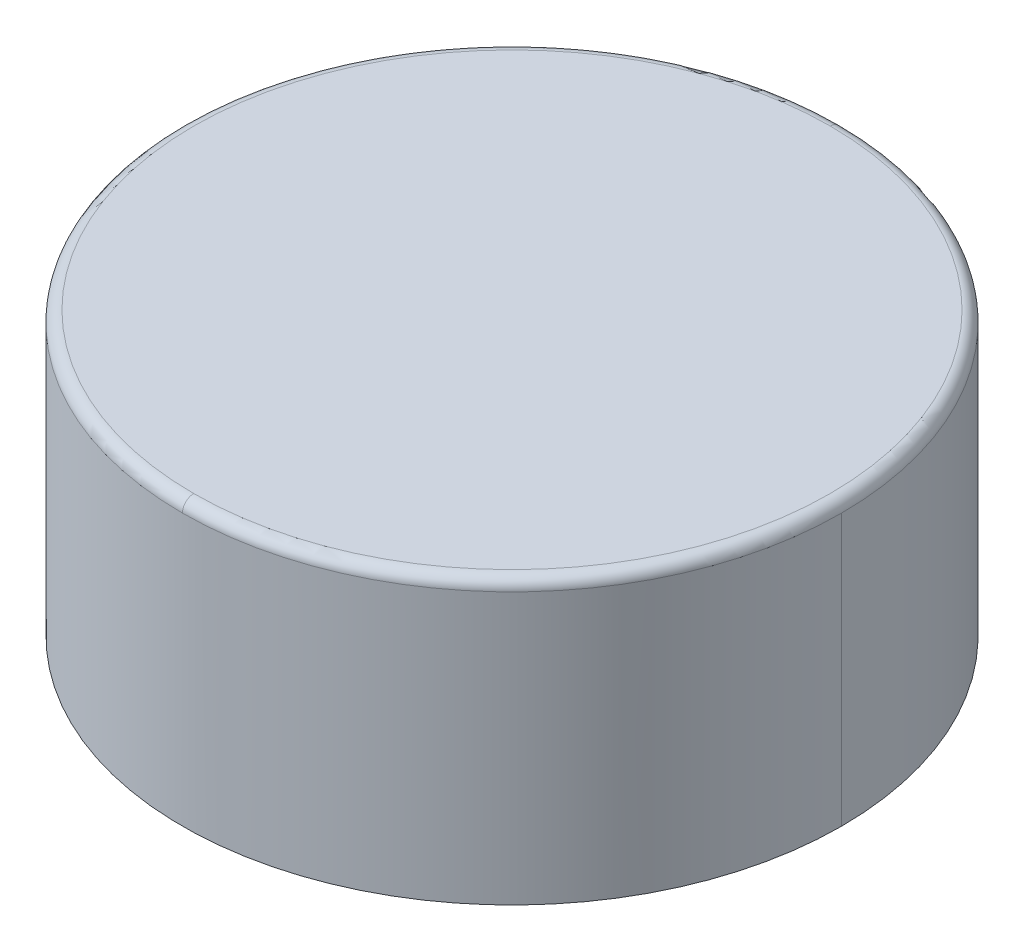
ISO-10303-21;
HEADER;
FILE_DESCRIPTION(('STEP AP214'),'2;1');
FILE_NAME('part.step','',(''),(''),'','','');
FILE_SCHEMA(('AUTOMOTIVE_DESIGN { 1 0 10303 214 1 1 1 1 }'));
ENDSEC;
DATA;
#1=APPLICATION_CONTEXT('core data for automotive mechanical design processes');
#2=APPLICATION_PROTOCOL_DEFINITION('international standard','automotive_design',2000,#1);
#3=PRODUCT_CONTEXT('',#1,'mechanical');
#4=PRODUCT('Part','Part','',(#3));
#5=PRODUCT_RELATED_PRODUCT_CATEGORY('part','',(#4));
#6=PRODUCT_DEFINITION_FORMATION('','',#4);
#7=PRODUCT_DEFINITION_CONTEXT('part definition',#1,'design');
#8=PRODUCT_DEFINITION('design','',#6,#7);
#9=PRODUCT_DEFINITION_SHAPE('','',#8);
#10=(LENGTH_UNIT() NAMED_UNIT(*) SI_UNIT(.MILLI.,.METRE.));
#11=(NAMED_UNIT(*) PLANE_ANGLE_UNIT() SI_UNIT($,.RADIAN.));
#12=(NAMED_UNIT(*) SI_UNIT($,.STERADIAN.) SOLID_ANGLE_UNIT());
#13=UNCERTAINTY_MEASURE_WITH_UNIT(LENGTH_MEASURE(1.E-05),#10,'distance_accuracy_value','');
#14=(GEOMETRIC_REPRESENTATION_CONTEXT(3) GLOBAL_UNCERTAINTY_ASSIGNED_CONTEXT((#13)) GLOBAL_UNIT_ASSIGNED_CONTEXT((#10,
#11,#12)) REPRESENTATION_CONTEXT('',''));
#15=CARTESIAN_POINT('',(0.,0.,0.));
#16=DIRECTION('',(0.,0.,1.));
#17=DIRECTION('',(1.,0.,0.));
#18=AXIS2_PLACEMENT_3D('',#15,#16,#17);
#19=CARTESIAN_POINT('',(6.25,3.625,21.03));
#20=DIRECTION('',(0.,1.,0.));
#21=DIRECTION('',(1.,0.,0.));
#22=AXIS2_PLACEMENT_3D('',#19,#20,#21);
#23=PLANE('',#22);
#24=CARTESIAN_POINT('',(6.25,3.625,21.03));
#25=DIRECTION('',(0.,-1.,0.));
#26=DIRECTION('',(1.,0.,0.));
#27=AXIS2_PLACEMENT_3D('',#24,#25,#26);
#28=CIRCLE('',#27,0.845);
#29=CARTESIAN_POINT('',(7.095,3.625,21.03));
#30=VERTEX_POINT('',#29);
#31=CARTESIAN_POINT('',(6.25,3.625,21.875));
#32=VERTEX_POINT('',#31);
#33=EDGE_CURVE('E11',#30,#32,#28,.T.);
#34=ORIENTED_EDGE('',*,*,#33,.F.);
#35=CARTESIAN_POINT('',(6.25,3.625,21.03));
#36=DIRECTION('',(0.,-1.,0.));
#37=DIRECTION('',(0.,0.,-1.));
#38=AXIS2_PLACEMENT_3D('',#35,#36,#37);
#39=CIRCLE('',#38,0.845);
#40=CARTESIAN_POINT('',(6.25,3.625,20.185));
#41=VERTEX_POINT('',#40);
#42=EDGE_CURVE('E27',#41,#30,#39,.T.);
#43=ORIENTED_EDGE('',*,*,#42,.F.);
#44=CARTESIAN_POINT('',(6.25,3.625,21.03));
#45=DIRECTION('',(0.,-1.,0.));
#46=DIRECTION('',(0.,0.,1.));
#47=AXIS2_PLACEMENT_3D('',#44,#45,#46);
#48=CIRCLE('',#47,0.845);
#49=EDGE_CURVE('E80',#32,#41,#48,.T.);
#50=ORIENTED_EDGE('',*,*,#49,.F.);
#51=EDGE_LOOP('',(#34,#43,#50));
#52=FACE_BOUND('',#51,.T.);
#53=ADVANCED_FACE('F17',(#52),#23,.T.);
#54=CARTESIAN_POINT('',(6.25,3.595,21.03));
#55=DIRECTION('',(0.,1.,0.));
#56=DIRECTION('',(0.,0.,1.));
#57=AXIS2_PLACEMENT_3D('',#54,#55,#56);
#58=TOROIDAL_SURFACE('',#57,0.845,0.03);
#59=CARTESIAN_POINT('',(6.25,3.595,21.875));
#60=DIRECTION('',(1.,0.,0.));
#61=DIRECTION('',(0.,1.,0.));
#62=AXIS2_PLACEMENT_3D('',#59,#60,#61);
#63=CIRCLE('',#62,0.03);
#64=CARTESIAN_POINT('',(6.25,3.595,21.905));
#65=VERTEX_POINT('',#64);
#66=EDGE_CURVE('E77',#32,#65,#63,.T.);
#67=ORIENTED_EDGE('',*,*,#66,.T.);
#68=CARTESIAN_POINT('',(6.25,3.595,21.03));
#69=DIRECTION('',(0.,-1.,0.));
#70=DIRECTION('',(1.,0.,0.));
#71=AXIS2_PLACEMENT_3D('',#68,#69,#70);
#72=CIRCLE('',#71,0.875);
#73=CARTESIAN_POINT('',(7.125,3.595,21.03));
#74=VERTEX_POINT('',#73);
#75=EDGE_CURVE('E113',#74,#65,#72,.T.);
#76=ORIENTED_EDGE('',*,*,#75,.F.);
#77=CARTESIAN_POINT('',(6.25,3.595,21.03));
#78=DIRECTION('',(0.,-1.,0.));
#79=DIRECTION('',(0.,0.,-1.));
#80=AXIS2_PLACEMENT_3D('',#77,#78,#79);
#81=CIRCLE('',#80,0.875);
#82=CARTESIAN_POINT('',(6.25,3.595,20.155));
#83=VERTEX_POINT('',#82);
#84=EDGE_CURVE('E21',#83,#74,#81,.T.);
#85=ORIENTED_EDGE('',*,*,#84,.F.);
#86=CARTESIAN_POINT('',(6.25,3.595,20.185));
#87=DIRECTION('',(-1.,0.,0.));
#88=DIRECTION('',(0.,1.,0.));
#89=AXIS2_PLACEMENT_3D('',#86,#87,#88);
#90=CIRCLE('',#89,0.03);
#91=EDGE_CURVE('E84',#41,#83,#90,.T.);
#92=ORIENTED_EDGE('',*,*,#91,.F.);
#93=ORIENTED_EDGE('',*,*,#42,.T.);
#94=ORIENTED_EDGE('',*,*,#33,.T.);
#95=EDGE_LOOP('',(#67,#76,#85,#92,#93,#94));
#96=FACE_BOUND('',#95,.T.);
#97=ADVANCED_FACE('F19',(#96),#58,.T.);
#98=CARTESIAN_POINT('',(6.25,2.875,21.03));
#99=DIRECTION('',(0.,1.,0.));
#100=DIRECTION('',(1.,0.,0.));
#101=AXIS2_PLACEMENT_3D('',#98,#99,#100);
#102=PLANE('',#101);
#103=CARTESIAN_POINT('',(6.25,2.875,21.03));
#104=DIRECTION('',(0.,1.,0.));
#105=DIRECTION('',(1.,0.,0.));
#106=AXIS2_PLACEMENT_3D('',#103,#104,#105);
#107=CIRCLE('',#106,0.875);
#108=CARTESIAN_POINT('',(7.125,2.875,21.03));
#109=VERTEX_POINT('',#108);
#110=CARTESIAN_POINT('',(5.375,2.875,21.03));
#111=VERTEX_POINT('',#110);
#112=EDGE_CURVE('E97',#109,#111,#107,.T.);
#113=ORIENTED_EDGE('',*,*,#112,.F.);
#114=CARTESIAN_POINT('',(6.25,2.875,21.03));
#115=DIRECTION('',(0.,1.,0.));
#116=DIRECTION('',(-1.,0.,0.));
#117=AXIS2_PLACEMENT_3D('',#114,#115,#116);
#118=CIRCLE('',#117,0.875);
#119=EDGE_CURVE('E103',#111,#109,#118,.T.);
#120=ORIENTED_EDGE('',*,*,#119,.F.);
#121=EDGE_LOOP('',(#113,#120));
#122=FACE_BOUND('',#121,.T.);
#123=ADVANCED_FACE('F163',(#122),#102,.F.);
#124=CARTESIAN_POINT('',(6.25,3.25,21.03));
#125=DIRECTION('',(0.,-1.,0.));
#126=DIRECTION('',(-1.,0.,0.));
#127=AXIS2_PLACEMENT_3D('',#124,#125,#126);
#128=CYLINDRICAL_SURFACE('',#127,0.875);
#129=CARTESIAN_POINT('',(6.25,3.595,21.03));
#130=DIRECTION('',(0.,-1.,0.));
#131=DIRECTION('',(-1.,0.,0.));
#132=AXIS2_PLACEMENT_3D('',#129,#130,#131);
#133=CIRCLE('',#132,0.875);
#134=CARTESIAN_POINT('',(5.375,3.595,21.03));
#135=VERTEX_POINT('',#134);
#136=EDGE_CURVE('E100',#135,#83,#133,.T.);
#137=ORIENTED_EDGE('',*,*,#136,.T.);
#138=ORIENTED_EDGE('',*,*,#84,.T.);
#139=DIRECTION('',(0.,1.,0.));
#140=VECTOR('',#139,1.);
#141=CARTESIAN_POINT('',(7.125,2.875,21.03));
#142=LINE('',#141,#140);
#143=EDGE_CURVE('E109',#109,#74,#142,.T.);
#144=ORIENTED_EDGE('',*,*,#143,.F.);
#145=ORIENTED_EDGE('',*,*,#112,.T.);
#146=DIRECTION('',(0.,1.,0.));
#147=VECTOR('',#146,1.);
#148=CARTESIAN_POINT('',(5.375,2.875,21.03));
#149=LINE('',#148,#147);
#150=EDGE_CURVE('E114',#111,#135,#149,.T.);
#151=ORIENTED_EDGE('',*,*,#150,.T.);
#152=EDGE_LOOP('',(#137,#138,#144,#145,#151));
#153=FACE_BOUND('',#152,.T.);
#154=ADVANCED_FACE('F152',(#153),#128,.T.);
#155=CARTESIAN_POINT('',(6.25,3.25,21.03));
#156=DIRECTION('',(0.,-1.,0.));
#157=DIRECTION('',(-1.,0.,0.));
#158=AXIS2_PLACEMENT_3D('',#155,#156,#157);
#159=CYLINDRICAL_SURFACE('',#158,0.875);
#160=ORIENTED_EDGE('',*,*,#119,.T.);
#161=ORIENTED_EDGE('',*,*,#143,.T.);
#162=ORIENTED_EDGE('',*,*,#75,.T.);
#163=CARTESIAN_POINT('',(6.25,3.595,21.03));
#164=DIRECTION('',(0.,-1.,0.));
#165=DIRECTION('',(0.,0.,1.));
#166=AXIS2_PLACEMENT_3D('',#163,#164,#165);
#167=CIRCLE('',#166,0.875);
#168=EDGE_CURVE('E90',#65,#135,#167,.T.);
#169=ORIENTED_EDGE('',*,*,#168,.T.);
#170=ORIENTED_EDGE('',*,*,#150,.F.);
#171=EDGE_LOOP('',(#160,#161,#162,#169,#170));
#172=FACE_BOUND('',#171,.T.);
#173=ADVANCED_FACE('F142',(#172),#159,.T.);
#174=CARTESIAN_POINT('',(6.25,3.595,21.03));
#175=DIRECTION('',(0.,1.,0.));
#176=DIRECTION('',(0.,0.,1.));
#177=AXIS2_PLACEMENT_3D('',#174,#175,#176);
#178=TOROIDAL_SURFACE('',#177,0.845,0.03);
#179=ORIENTED_EDGE('',*,*,#66,.F.);
#180=ORIENTED_EDGE('',*,*,#49,.T.);
#181=ORIENTED_EDGE('',*,*,#91,.T.);
#182=ORIENTED_EDGE('',*,*,#136,.F.);
#183=ORIENTED_EDGE('',*,*,#168,.F.);
#184=EDGE_LOOP('',(#179,#180,#181,#182,#183));
#185=FACE_BOUND('',#184,.T.);
#186=ADVANCED_FACE('F87',(#185),#178,.T.);
#187=CLOSED_SHELL('',(#53,#97,#123,#154,#173,#186));
#188=MANIFOLD_SOLID_BREP('B1',#187);
#189=ADVANCED_BREP_SHAPE_REPRESENTATION('',(#18,#188),#14);
#190=SHAPE_DEFINITION_REPRESENTATION(#9,#189);
ENDSEC;
END-ISO-10303-21;
